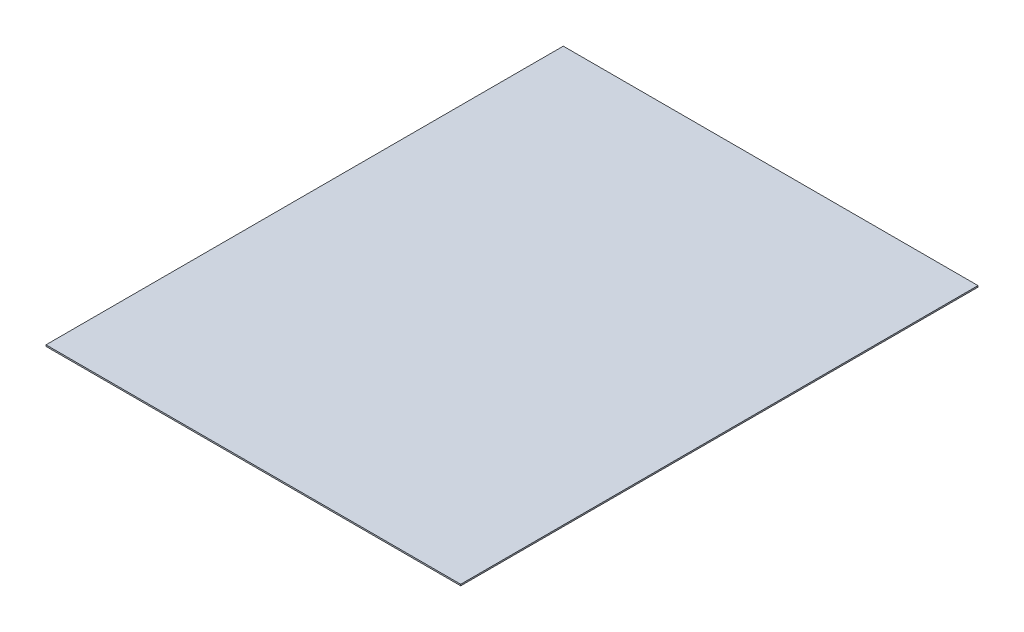
ISO-10303-21;
HEADER;
FILE_DESCRIPTION(('STEP AP214'),'2;1');
FILE_NAME('part.step','',(''),(''),'','','');
FILE_SCHEMA(('AUTOMOTIVE_DESIGN { 1 0 10303 214 1 1 1 1 }'));
ENDSEC;
DATA;
#1=APPLICATION_CONTEXT('core data for automotive mechanical design processes');
#2=APPLICATION_PROTOCOL_DEFINITION('international standard','automotive_design',2000,#1);
#3=PRODUCT_CONTEXT('',#1,'mechanical');
#4=PRODUCT('Part','Part','',(#3));
#5=PRODUCT_RELATED_PRODUCT_CATEGORY('part','',(#4));
#6=PRODUCT_DEFINITION_FORMATION('','',#4);
#7=PRODUCT_DEFINITION_CONTEXT('part definition',#1,'design');
#8=PRODUCT_DEFINITION('design','',#6,#7);
#9=PRODUCT_DEFINITION_SHAPE('','',#8);
#10=(LENGTH_UNIT() NAMED_UNIT(*) SI_UNIT(.MILLI.,.METRE.));
#11=(NAMED_UNIT(*) PLANE_ANGLE_UNIT() SI_UNIT($,.RADIAN.));
#12=(NAMED_UNIT(*) SI_UNIT($,.STERADIAN.) SOLID_ANGLE_UNIT());
#13=UNCERTAINTY_MEASURE_WITH_UNIT(LENGTH_MEASURE(1.E-05),#10,'distance_accuracy_value','');
#14=(GEOMETRIC_REPRESENTATION_CONTEXT(3) GLOBAL_UNCERTAINTY_ASSIGNED_CONTEXT((#13)) GLOBAL_UNIT_ASSIGNED_CONTEXT((#10,
#11,#12)) REPRESENTATION_CONTEXT('',''));
#15=CARTESIAN_POINT('',(0.,0.,0.));
#16=DIRECTION('',(0.,0.,1.));
#17=DIRECTION('',(1.,0.,0.));
#18=AXIS2_PLACEMENT_3D('',#15,#16,#17);
#19=CARTESIAN_POINT('',(0.,25.4,0.));
#20=DIRECTION('',(1.,0.,0.));
#21=DIRECTION('',(0.,0.,-1.));
#22=AXIS2_PLACEMENT_3D('',#19,#20,#21);
#23=PLANE('',#22);
#24=DIRECTION('',(0.,0.,1.));
#25=VECTOR('',#24,1.);
#26=CARTESIAN_POINT('',(0.,0.,0.));
#27=LINE('',#26,#25);
#28=CARTESIAN_POINT('',(0.,0.,-9235.48453082147));
#29=VERTEX_POINT('',#28);
#30=CARTESIAN_POINT('',(0.,0.,0.));
#31=VERTEX_POINT('',#30);
#32=EDGE_CURVE('E98',#29,#31,#27,.T.);
#33=ORIENTED_EDGE('',*,*,#32,.T.);
#34=DIRECTION('',(0.,-1.,0.));
#35=VECTOR('',#34,1.);
#36=CARTESIAN_POINT('',(0.,25.4,0.));
#37=LINE('',#36,#35);
#38=CARTESIAN_POINT('',(0.,25.4,0.));
#39=VERTEX_POINT('',#38);
#40=EDGE_CURVE('E11',#39,#31,#37,.T.);
#41=ORIENTED_EDGE('',*,*,#40,.F.);
#42=DIRECTION('',(0.,0.,1.));
#43=VECTOR('',#42,1.);
#44=CARTESIAN_POINT('',(0.,25.4,0.));
#45=LINE('',#44,#43);
#46=CARTESIAN_POINT('',(0.,25.4,-9235.48453082147));
#47=VERTEX_POINT('',#46);
#48=EDGE_CURVE('E86',#47,#39,#45,.T.);
#49=ORIENTED_EDGE('',*,*,#48,.F.);
#50=DIRECTION('',(0.,-1.,0.));
#51=VECTOR('',#50,1.);
#52=CARTESIAN_POINT('',(0.,25.4,-9235.48453082147));
#53=LINE('',#52,#51);
#54=EDGE_CURVE('E94',#47,#29,#53,.T.);
#55=ORIENTED_EDGE('',*,*,#54,.T.);
#56=EDGE_LOOP('',(#33,#41,#49,#55));
#57=FACE_BOUND('',#56,.T.);
#58=ADVANCED_FACE('F35',(#57),#23,.F.);
#59=CARTESIAN_POINT('',(0.,25.4,0.));
#60=DIRECTION('',(0.,0.,-1.));
#61=DIRECTION('',(-1.,0.,0.));
#62=AXIS2_PLACEMENT_3D('',#59,#60,#61);
#63=PLANE('',#62);
#64=DIRECTION('',(1.,0.,0.));
#65=VECTOR('',#64,1.);
#66=CARTESIAN_POINT('',(0.,0.,0.));
#67=LINE('',#66,#65);
#68=CARTESIAN_POINT('',(7404.21729634971,0.,0.));
#69=VERTEX_POINT('',#68);
#70=EDGE_CURVE('E90',#31,#69,#67,.T.);
#71=ORIENTED_EDGE('',*,*,#70,.T.);
#72=DIRECTION('',(0.,-1.,0.));
#73=VECTOR('',#72,1.);
#74=CARTESIAN_POINT('',(7404.21729634971,25.4,0.));
#75=LINE('',#74,#73);
#76=CARTESIAN_POINT('',(7404.21729634971,25.4,0.));
#77=VERTEX_POINT('',#76);
#78=EDGE_CURVE('E43',#77,#69,#75,.T.);
#79=ORIENTED_EDGE('',*,*,#78,.F.);
#80=DIRECTION('',(1.,0.,0.));
#81=VECTOR('',#80,1.);
#82=CARTESIAN_POINT('',(0.,25.4,0.));
#83=LINE('',#82,#81);
#84=EDGE_CURVE('E81',#39,#77,#83,.T.);
#85=ORIENTED_EDGE('',*,*,#84,.F.);
#86=ORIENTED_EDGE('',*,*,#40,.T.);
#87=EDGE_LOOP('',(#71,#79,#85,#86));
#88=FACE_BOUND('',#87,.T.);
#89=ADVANCED_FACE('F89',(#88),#63,.F.);
#90=CARTESIAN_POINT('',(7404.21729634971,25.4,0.));
#91=DIRECTION('',(-1.,0.,0.));
#92=DIRECTION('',(0.,0.,1.));
#93=AXIS2_PLACEMENT_3D('',#90,#91,#92);
#94=PLANE('',#93);
#95=DIRECTION('',(0.,0.,-1.));
#96=VECTOR('',#95,1.);
#97=CARTESIAN_POINT('',(7404.21729634971,0.,0.));
#98=LINE('',#97,#96);
#99=CARTESIAN_POINT('',(7404.21729634971,0.,-9235.48453082147));
#100=VERTEX_POINT('',#99);
#101=EDGE_CURVE('E68',#69,#100,#98,.T.);
#102=ORIENTED_EDGE('',*,*,#101,.T.);
#103=DIRECTION('',(0.,-1.,0.));
#104=VECTOR('',#103,1.);
#105=CARTESIAN_POINT('',(7404.21729634971,25.4,-9235.48453082147));
#106=LINE('',#105,#104);
#107=CARTESIAN_POINT('',(7404.21729634971,25.4,-9235.48453082147));
#108=VERTEX_POINT('',#107);
#109=EDGE_CURVE('E91',#108,#100,#106,.T.);
#110=ORIENTED_EDGE('',*,*,#109,.F.);
#111=DIRECTION('',(0.,0.,-1.));
#112=VECTOR('',#111,1.);
#113=CARTESIAN_POINT('',(7404.21729634971,25.4,0.));
#114=LINE('',#113,#112);
#115=EDGE_CURVE('E84',#77,#108,#114,.T.);
#116=ORIENTED_EDGE('',*,*,#115,.F.);
#117=ORIENTED_EDGE('',*,*,#78,.T.);
#118=EDGE_LOOP('',(#102,#110,#116,#117));
#119=FACE_BOUND('',#118,.T.);
#120=ADVANCED_FACE('F92',(#119),#94,.F.);
#121=CARTESIAN_POINT('',(0.,25.4,-9235.48453082147));
#122=DIRECTION('',(0.,0.,1.));
#123=DIRECTION('',(1.,0.,0.));
#124=AXIS2_PLACEMENT_3D('',#121,#122,#123);
#125=PLANE('',#124);
#126=DIRECTION('',(-1.,0.,0.));
#127=VECTOR('',#126,1.);
#128=CARTESIAN_POINT('',(0.,0.,-9235.48453082147));
#129=LINE('',#128,#127);
#130=EDGE_CURVE('E74',#100,#29,#129,.T.);
#131=ORIENTED_EDGE('',*,*,#130,.T.);
#132=ORIENTED_EDGE('',*,*,#54,.F.);
#133=DIRECTION('',(-1.,0.,0.));
#134=VECTOR('',#133,1.);
#135=CARTESIAN_POINT('',(0.,25.4,-9235.48453082147));
#136=LINE('',#135,#134);
#137=EDGE_CURVE('E51',#108,#47,#136,.T.);
#138=ORIENTED_EDGE('',*,*,#137,.F.);
#139=ORIENTED_EDGE('',*,*,#109,.T.);
#140=EDGE_LOOP('',(#131,#132,#138,#139));
#141=FACE_BOUND('',#140,.T.);
#142=ADVANCED_FACE('F105',(#141),#125,.F.);
#143=CARTESIAN_POINT('',(0.,25.4,-9235.48453082147));
#144=DIRECTION('',(0.,-1.,0.));
#145=DIRECTION('',(0.,0.,-1.));
#146=AXIS2_PLACEMENT_3D('',#143,#144,#145);
#147=PLANE('',#146);
#148=ORIENTED_EDGE('',*,*,#48,.T.);
#149=ORIENTED_EDGE('',*,*,#84,.T.);
#150=ORIENTED_EDGE('',*,*,#115,.T.);
#151=ORIENTED_EDGE('',*,*,#137,.T.);
#152=EDGE_LOOP('',(#148,#149,#150,#151));
#153=FACE_BOUND('',#152,.T.);
#154=ADVANCED_FACE('F82',(#153),#147,.F.);
#155=CARTESIAN_POINT('',(0.,0.,-9235.48453082147));
#156=DIRECTION('',(0.,-1.,0.));
#157=DIRECTION('',(0.,0.,-1.));
#158=AXIS2_PLACEMENT_3D('',#155,#156,#157);
#159=PLANE('',#158);
#160=ORIENTED_EDGE('',*,*,#32,.F.);
#161=ORIENTED_EDGE('',*,*,#130,.F.);
#162=ORIENTED_EDGE('',*,*,#101,.F.);
#163=ORIENTED_EDGE('',*,*,#70,.F.);
#164=EDGE_LOOP('',(#160,#161,#162,#163));
#165=FACE_BOUND('',#164,.T.);
#166=ADVANCED_FACE('F108',(#165),#159,.T.);
#167=CLOSED_SHELL('',(#58,#89,#120,#142,#154,#166));
#168=MANIFOLD_SOLID_BREP('B2',#167);
#169=ADVANCED_BREP_SHAPE_REPRESENTATION('',(#18,#168),#14);
#170=SHAPE_DEFINITION_REPRESENTATION(#9,#169);
ENDSEC;
END-ISO-10303-21;
